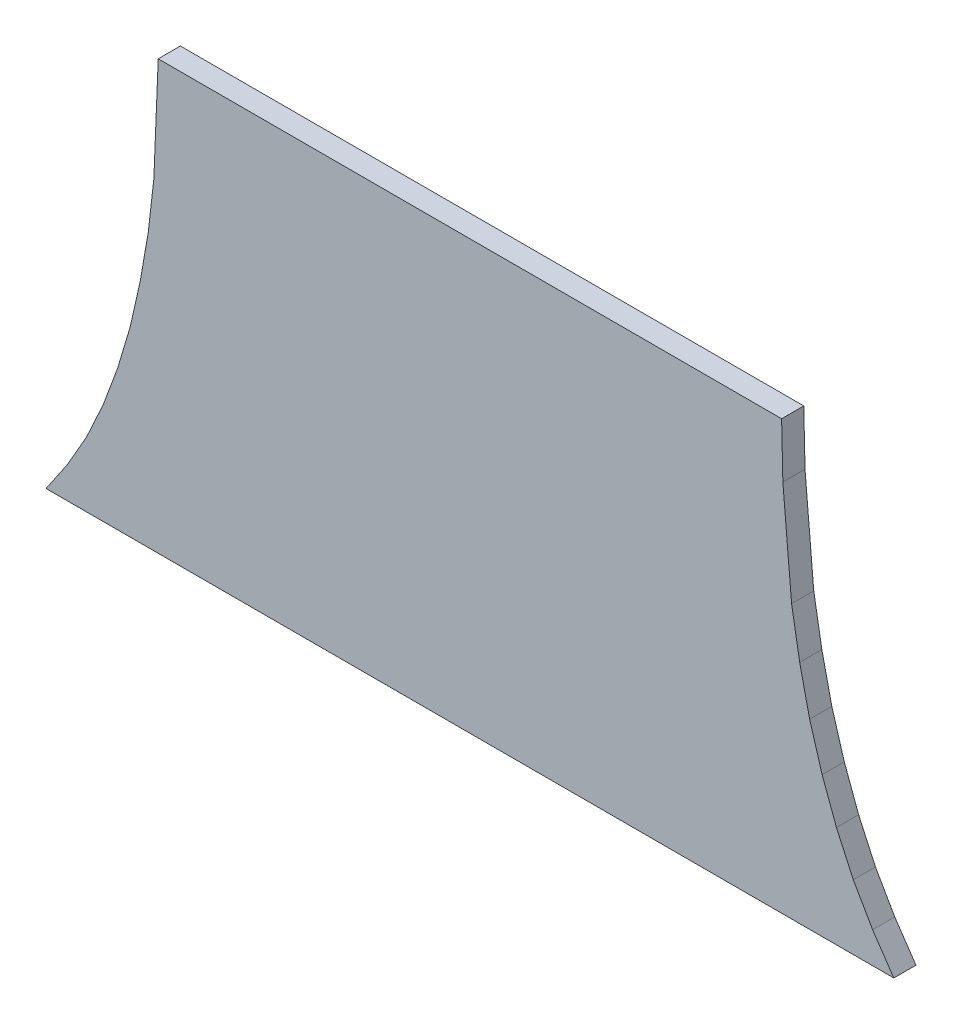
ISO-10303-21;
HEADER;
FILE_DESCRIPTION(('STEP AP214'),'2;1');
FILE_NAME('part.step','',(''),(''),'','','');
FILE_SCHEMA(('AUTOMOTIVE_DESIGN { 1 0 10303 214 1 1 1 1 }'));
ENDSEC;
DATA;
#1=APPLICATION_CONTEXT('core data for automotive mechanical design processes');
#2=APPLICATION_PROTOCOL_DEFINITION('international standard','automotive_design',2000,#1);
#3=PRODUCT_CONTEXT('',#1,'mechanical');
#4=PRODUCT('Part','Part','',(#3));
#5=PRODUCT_RELATED_PRODUCT_CATEGORY('part','',(#4));
#6=PRODUCT_DEFINITION_FORMATION('','',#4);
#7=PRODUCT_DEFINITION_CONTEXT('part definition',#1,'design');
#8=PRODUCT_DEFINITION('design','',#6,#7);
#9=PRODUCT_DEFINITION_SHAPE('','',#8);
#10=(LENGTH_UNIT() NAMED_UNIT(*) SI_UNIT(.MILLI.,.METRE.));
#11=(NAMED_UNIT(*) PLANE_ANGLE_UNIT() SI_UNIT($,.RADIAN.));
#12=(NAMED_UNIT(*) SI_UNIT($,.STERADIAN.) SOLID_ANGLE_UNIT());
#13=UNCERTAINTY_MEASURE_WITH_UNIT(LENGTH_MEASURE(1.E-05),#10,'distance_accuracy_value','');
#14=(GEOMETRIC_REPRESENTATION_CONTEXT(3) GLOBAL_UNCERTAINTY_ASSIGNED_CONTEXT((#13)) GLOBAL_UNIT_ASSIGNED_CONTEXT((#10,
#11,#12)) REPRESENTATION_CONTEXT('',''));
#15=CARTESIAN_POINT('',(0.,0.,0.));
#16=DIRECTION('',(0.,0.,1.));
#17=DIRECTION('',(1.,0.,0.));
#18=AXIS2_PLACEMENT_3D('',#15,#16,#17);
#19=CARTESIAN_POINT('',(77.5899963378906,105.467002868652,0.));
#20=DIRECTION('',(0.999154312002773,-0.0411176459231945,0.));
#21=DIRECTION('',(-0.0411176459231945,-0.999154312002773,0.));
#22=AXIS2_PLACEMENT_3D('',#19,#20,#21);
#23=PLANE('',#22);
#24=DIRECTION('',(-0.0411176459231945,-0.999154312002773,0.));
#25=VECTOR('',#24,1.);
#26=CARTESIAN_POINT('',(77.5899963378906,105.467002868652,0.03556));
#27=LINE('',#26,#25);
#28=CARTESIAN_POINT('',(77.5899963378906,105.467002868652,0.03556));
#29=VERTEX_POINT('',#28);
#30=CARTESIAN_POINT('',(77.5830001831055,105.296997070313,0.03556));
#31=VERTEX_POINT('',#30);
#32=EDGE_CURVE('E11',#29,#31,#27,.T.);
#33=ORIENTED_EDGE('',*,*,#32,.F.);
#34=DIRECTION('',(0.,0.,1.));
#35=VECTOR('',#34,1.);
#36=CARTESIAN_POINT('',(77.5899963378906,105.467002868652,0.));
#37=LINE('',#36,#35);
#38=CARTESIAN_POINT('',(77.5899963378906,105.467002868652,0.));
#39=VERTEX_POINT('',#38);
#40=EDGE_CURVE('E24',#39,#29,#37,.T.);
#41=ORIENTED_EDGE('',*,*,#40,.F.);
#42=DIRECTION('',(-0.0411176459231945,-0.999154312002773,0.));
#43=VECTOR('',#42,1.);
#44=CARTESIAN_POINT('',(77.5899963378906,105.467002868652,0.));
#45=LINE('',#44,#43);
#46=CARTESIAN_POINT('',(77.5830001831055,105.296997070313,0.));
#47=VERTEX_POINT('',#46);
#48=EDGE_CURVE('E172',#39,#47,#45,.T.);
#49=ORIENTED_EDGE('',*,*,#48,.T.);
#50=DIRECTION('',(0.,0.,1.));
#51=VECTOR('',#50,1.);
#52=CARTESIAN_POINT('',(77.5830001831055,105.296997070313,0.));
#53=LINE('',#52,#51);
#54=EDGE_CURVE('E37',#47,#31,#53,.T.);
#55=ORIENTED_EDGE('',*,*,#54,.T.);
#56=EDGE_LOOP('',(#33,#41,#49,#55));
#57=FACE_BOUND('',#56,.T.);
#58=ADVANCED_FACE('F17',(#57),#23,.F.);
#59=CARTESIAN_POINT('',(77.5830001831055,105.296997070313,0.));
#60=DIRECTION('',(0.993568501687247,-0.113232647478361,0.));
#61=DIRECTION('',(-0.113232647478361,-0.993568501687247,0.));
#62=AXIS2_PLACEMENT_3D('',#59,#60,#61);
#63=PLANE('',#62);
#64=DIRECTION('',(-0.113232647478361,-0.993568501687247,0.));
#65=VECTOR('',#64,1.);
#66=CARTESIAN_POINT('',(77.5830001831055,105.296997070313,0.03556));
#67=LINE('',#66,#65);
#68=CARTESIAN_POINT('',(77.5739974975586,105.218002319336,0.03556));
#69=VERTEX_POINT('',#68);
#70=EDGE_CURVE('E308',#31,#69,#67,.T.);
#71=ORIENTED_EDGE('',*,*,#70,.F.);
#72=ORIENTED_EDGE('',*,*,#54,.F.);
#73=DIRECTION('',(-0.113232647478361,-0.993568501687247,0.));
#74=VECTOR('',#73,1.);
#75=CARTESIAN_POINT('',(77.5830001831055,105.296997070313,0.));
#76=LINE('',#75,#74);
#77=CARTESIAN_POINT('',(77.5739974975586,105.218002319336,0.));
#78=VERTEX_POINT('',#77);
#79=EDGE_CURVE('E305',#47,#78,#76,.T.);
#80=ORIENTED_EDGE('',*,*,#79,.T.);
#81=DIRECTION('',(0.,0.,1.));
#82=VECTOR('',#81,1.);
#83=CARTESIAN_POINT('',(77.5739974975586,105.218002319336,0.));
#84=LINE('',#83,#82);
#85=EDGE_CURVE('E303',#78,#69,#84,.T.);
#86=ORIENTED_EDGE('',*,*,#85,.T.);
#87=EDGE_LOOP('',(#71,#72,#80,#86));
#88=FACE_BOUND('',#87,.T.);
#89=ADVANCED_FACE('F316',(#88),#63,.F.);
#90=CARTESIAN_POINT('',(77.5739974975586,105.218002319336,0.));
#91=DIRECTION('',(0.98530869501432,-0.170782831482494,0.));
#92=DIRECTION('',(-0.170782831482494,-0.98530869501432,0.));
#93=AXIS2_PLACEMENT_3D('',#90,#91,#92);
#94=PLANE('',#93);
#95=DIRECTION('',(-0.170782831482494,-0.98530869501432,0.));
#96=VECTOR('',#95,1.);
#97=CARTESIAN_POINT('',(77.5739974975586,105.218002319336,0.03556));
#98=LINE('',#97,#96);
#99=CARTESIAN_POINT('',(77.5609970092774,105.142997741699,0.03556));
#100=VERTEX_POINT('',#99);
#101=EDGE_CURVE('E300',#69,#100,#98,.T.);
#102=ORIENTED_EDGE('',*,*,#101,.F.);
#103=ORIENTED_EDGE('',*,*,#85,.F.);
#104=DIRECTION('',(-0.170782831482494,-0.98530869501432,0.));
#105=VECTOR('',#104,1.);
#106=CARTESIAN_POINT('',(77.5739974975586,105.218002319336,0.));
#107=LINE('',#106,#105);
#108=CARTESIAN_POINT('',(77.5609970092774,105.142997741699,0.));
#109=VERTEX_POINT('',#108);
#110=EDGE_CURVE('E297',#78,#109,#107,.T.);
#111=ORIENTED_EDGE('',*,*,#110,.T.);
#112=DIRECTION('',(0.,0.,1.));
#113=VECTOR('',#112,1.);
#114=CARTESIAN_POINT('',(77.5609970092774,105.142997741699,0.));
#115=LINE('',#114,#113);
#116=EDGE_CURVE('E295',#109,#100,#115,.T.);
#117=ORIENTED_EDGE('',*,*,#116,.T.);
#118=EDGE_LOOP('',(#102,#103,#111,#117));
#119=FACE_BOUND('',#118,.T.);
#120=ADVANCED_FACE('F322',(#119),#94,.F.);
#121=CARTESIAN_POINT('',(77.5609970092774,105.142997741699,0.));
#122=DIRECTION('',(0.975538987966482,-0.219826483748733,0.));
#123=DIRECTION('',(-0.219826483748733,-0.975538987966482,0.));
#124=AXIS2_PLACEMENT_3D('',#121,#122,#123);
#125=PLANE('',#124);
#126=DIRECTION('',(-0.219826483748733,-0.975538987966482,0.));
#127=VECTOR('',#126,1.);
#128=CARTESIAN_POINT('',(77.5609970092774,105.142997741699,0.03556));
#129=LINE('',#128,#127);
#130=CARTESIAN_POINT('',(77.5449981689453,105.071998596191,0.03556));
#131=VERTEX_POINT('',#130);
#132=EDGE_CURVE('E292',#100,#131,#129,.T.);
#133=ORIENTED_EDGE('',*,*,#132,.F.);
#134=ORIENTED_EDGE('',*,*,#116,.F.);
#135=DIRECTION('',(-0.219826483748733,-0.975538987966482,0.));
#136=VECTOR('',#135,1.);
#137=CARTESIAN_POINT('',(77.5609970092774,105.142997741699,0.));
#138=LINE('',#137,#136);
#139=CARTESIAN_POINT('',(77.5449981689453,105.071998596191,0.));
#140=VERTEX_POINT('',#139);
#141=EDGE_CURVE('E289',#109,#140,#138,.T.);
#142=ORIENTED_EDGE('',*,*,#141,.T.);
#143=DIRECTION('',(0.,0.,1.));
#144=VECTOR('',#143,1.);
#145=CARTESIAN_POINT('',(77.5449981689453,105.071998596191,0.));
#146=LINE('',#145,#144);
#147=EDGE_CURVE('E287',#140,#131,#146,.T.);
#148=ORIENTED_EDGE('',*,*,#147,.T.);
#149=EDGE_LOOP('',(#133,#134,#142,#148));
#150=FACE_BOUND('',#149,.T.);
#151=ADVANCED_FACE('F324',(#150),#125,.F.);
#152=CARTESIAN_POINT('',(77.5449981689453,105.071998596191,0.));
#153=DIRECTION('',(0.958233742102819,-0.285986180602538,0.));
#154=DIRECTION('',(-0.285986180602538,-0.958233742102819,0.));
#155=AXIS2_PLACEMENT_3D('',#152,#153,#154);
#156=PLANE('',#155);
#157=DIRECTION('',(-0.285986180602538,-0.958233742102819,0.));
#158=VECTOR('',#157,1.);
#159=CARTESIAN_POINT('',(77.5449981689453,105.071998596191,0.03556));
#160=LINE('',#159,#158);
#161=CARTESIAN_POINT('',(77.5250015258789,105.004997253418,0.03556));
#162=VERTEX_POINT('',#161);
#163=EDGE_CURVE('E284',#131,#162,#160,.T.);
#164=ORIENTED_EDGE('',*,*,#163,.F.);
#165=ORIENTED_EDGE('',*,*,#147,.F.);
#166=DIRECTION('',(-0.285986180602538,-0.958233742102819,0.));
#167=VECTOR('',#166,1.);
#168=CARTESIAN_POINT('',(77.5449981689453,105.071998596191,0.));
#169=LINE('',#168,#167);
#170=CARTESIAN_POINT('',(77.5250015258789,105.004997253418,0.));
#171=VERTEX_POINT('',#170);
#172=EDGE_CURVE('E281',#140,#171,#169,.T.);
#173=ORIENTED_EDGE('',*,*,#172,.T.);
#174=DIRECTION('',(0.,0.,1.));
#175=VECTOR('',#174,1.);
#176=CARTESIAN_POINT('',(77.5250015258789,105.004997253418,0.));
#177=LINE('',#176,#175);
#178=EDGE_CURVE('E279',#171,#162,#177,.T.);
#179=ORIENTED_EDGE('',*,*,#178,.T.);
#180=EDGE_LOOP('',(#164,#165,#173,#179));
#181=FACE_BOUND('',#180,.T.);
#182=ADVANCED_FACE('F329',(#181),#156,.F.);
#183=CARTESIAN_POINT('',(77.5250015258789,105.004997253418,0.));
#184=DIRECTION('',(0.93754679850257,-0.347859167792918,0.));
#185=DIRECTION('',(-0.347859167792918,-0.93754679850257,0.));
#186=AXIS2_PLACEMENT_3D('',#183,#184,#185);
#187=PLANE('',#186);
#188=DIRECTION('',(-0.347859167792918,-0.93754679850257,0.));
#189=VECTOR('',#188,1.);
#190=CARTESIAN_POINT('',(77.5250015258789,105.004997253418,0.03556));
#191=LINE('',#190,#189);
#192=CARTESIAN_POINT('',(77.5019989013672,104.943000793457,0.03556));
#193=VERTEX_POINT('',#192);
#194=EDGE_CURVE('E276',#162,#193,#191,.T.);
#195=ORIENTED_EDGE('',*,*,#194,.F.);
#196=ORIENTED_EDGE('',*,*,#178,.F.);
#197=DIRECTION('',(-0.347859167792918,-0.93754679850257,0.));
#198=VECTOR('',#197,1.);
#199=CARTESIAN_POINT('',(77.5250015258789,105.004997253418,0.));
#200=LINE('',#199,#198);
#201=CARTESIAN_POINT('',(77.5019989013672,104.943000793457,0.));
#202=VERTEX_POINT('',#201);
#203=EDGE_CURVE('E273',#171,#202,#200,.T.);
#204=ORIENTED_EDGE('',*,*,#203,.T.);
#205=DIRECTION('',(0.,0.,1.));
#206=VECTOR('',#205,1.);
#207=CARTESIAN_POINT('',(77.5019989013672,104.943000793457,0.));
#208=LINE('',#207,#206);
#209=EDGE_CURVE('E271',#202,#193,#208,.T.);
#210=ORIENTED_EDGE('',*,*,#209,.T.);
#211=EDGE_LOOP('',(#195,#196,#204,#210));
#212=FACE_BOUND('',#211,.T.);
#213=ADVANCED_FACE('F332',(#212),#187,.F.);
#214=CARTESIAN_POINT('',(77.5019989013672,104.943000793457,0.));
#215=DIRECTION('',(0.909300357598648,-0.416140432631788,0.));
#216=DIRECTION('',(-0.416140432631788,-0.909300357598648,0.));
#217=AXIS2_PLACEMENT_3D('',#214,#215,#216);
#218=PLANE('',#217);
#219=DIRECTION('',(-0.416140432631788,-0.909300357598648,0.));
#220=VECTOR('',#219,1.);
#221=CARTESIAN_POINT('',(77.5019989013672,104.943000793457,0.03556));
#222=LINE('',#221,#220);
#223=CARTESIAN_POINT('',(77.4749984741211,104.884002685547,0.03556));
#224=VERTEX_POINT('',#223);
#225=EDGE_CURVE('E268',#193,#224,#222,.T.);
#226=ORIENTED_EDGE('',*,*,#225,.F.);
#227=ORIENTED_EDGE('',*,*,#209,.F.);
#228=DIRECTION('',(-0.416140432631788,-0.909300357598648,0.));
#229=VECTOR('',#228,1.);
#230=CARTESIAN_POINT('',(77.5019989013672,104.943000793457,0.));
#231=LINE('',#230,#229);
#232=CARTESIAN_POINT('',(77.4749984741211,104.884002685547,0.));
#233=VERTEX_POINT('',#232);
#234=EDGE_CURVE('E265',#202,#233,#231,.T.);
#235=ORIENTED_EDGE('',*,*,#234,.T.);
#236=DIRECTION('',(0.,0.,1.));
#237=VECTOR('',#236,1.);
#238=CARTESIAN_POINT('',(77.4749984741211,104.884002685547,0.));
#239=LINE('',#238,#237);
#240=EDGE_CURVE('E263',#233,#224,#239,.T.);
#241=ORIENTED_EDGE('',*,*,#240,.T.);
#242=EDGE_LOOP('',(#226,#227,#235,#241));
#243=FACE_BOUND('',#242,.T.);
#244=ADVANCED_FACE('F337',(#243),#218,.F.);
#245=CARTESIAN_POINT('',(77.4749984741211,104.884002685547,0.));
#246=DIRECTION('',(0.867268772180106,-0.497840212117515,0.));
#247=DIRECTION('',(-0.497840212117515,-0.867268772180106,0.));
#248=AXIS2_PLACEMENT_3D('',#245,#246,#247);
#249=PLANE('',#248);
#250=DIRECTION('',(-0.497840212117515,-0.867268772180106,0.));
#251=VECTOR('',#250,1.);
#252=CARTESIAN_POINT('',(77.4749984741211,104.884002685547,0.03556));
#253=LINE('',#252,#251);
#254=CARTESIAN_POINT('',(77.4440002441406,104.830001831055,0.03556));
#255=VERTEX_POINT('',#254);
#256=EDGE_CURVE('E260',#224,#255,#253,.T.);
#257=ORIENTED_EDGE('',*,*,#256,.F.);
#258=ORIENTED_EDGE('',*,*,#240,.F.);
#259=DIRECTION('',(-0.497840212117515,-0.867268772180106,0.));
#260=VECTOR('',#259,1.);
#261=CARTESIAN_POINT('',(77.4749984741211,104.884002685547,0.));
#262=LINE('',#261,#260);
#263=CARTESIAN_POINT('',(77.4440002441406,104.830001831055,0.));
#264=VERTEX_POINT('',#263);
#265=EDGE_CURVE('E257',#233,#264,#262,.T.);
#266=ORIENTED_EDGE('',*,*,#265,.T.);
#267=DIRECTION('',(0.,0.,1.));
#268=VECTOR('',#267,1.);
#269=CARTESIAN_POINT('',(77.4440002441406,104.830001831055,0.));
#270=LINE('',#269,#268);
#271=EDGE_CURVE('E255',#264,#255,#270,.T.);
#272=ORIENTED_EDGE('',*,*,#271,.T.);
#273=EDGE_LOOP('',(#257,#258,#266,#272));
#274=FACE_BOUND('',#273,.T.);
#275=ADVANCED_FACE('F340',(#274),#249,.F.);
#276=CARTESIAN_POINT('',(77.4440002441406,104.830001831055,0.));
#277=DIRECTION('',(0.826968743041032,-0.562247897313219,0.));
#278=DIRECTION('',(-0.562247897313219,-0.826968743041032,0.));
#279=AXIS2_PLACEMENT_3D('',#276,#277,#278);
#280=PLANE('',#279);
#281=DIRECTION('',(-0.562247897313219,-0.826968743041032,0.));
#282=VECTOR('',#281,1.);
#283=CARTESIAN_POINT('',(77.4440002441406,104.830001831055,0.03556));
#284=LINE('',#283,#282);
#285=CARTESIAN_POINT('',(77.4100036621094,104.779998779297,0.03556));
#286=VERTEX_POINT('',#285);
#287=EDGE_CURVE('E252',#255,#286,#284,.T.);
#288=ORIENTED_EDGE('',*,*,#287,.F.);
#289=ORIENTED_EDGE('',*,*,#271,.F.);
#290=DIRECTION('',(-0.562247897313219,-0.826968743041032,0.));
#291=VECTOR('',#290,1.);
#292=CARTESIAN_POINT('',(77.4440002441406,104.830001831055,0.));
#293=LINE('',#292,#291);
#294=CARTESIAN_POINT('',(77.4100036621094,104.779998779297,0.));
#295=VERTEX_POINT('',#294);
#296=EDGE_CURVE('E249',#264,#295,#293,.T.);
#297=ORIENTED_EDGE('',*,*,#296,.T.);
#298=DIRECTION('',(0.,0.,1.));
#299=VECTOR('',#298,1.);
#300=CARTESIAN_POINT('',(77.4100036621094,104.779998779297,0.));
#301=LINE('',#300,#299);
#302=EDGE_CURVE('E247',#295,#286,#301,.T.);
#303=ORIENTED_EDGE('',*,*,#302,.T.);
#304=EDGE_LOOP('',(#288,#289,#297,#303));
#305=FACE_BOUND('',#304,.T.);
#306=ADVANCED_FACE('F345',(#305),#280,.F.);
#307=CARTESIAN_POINT('',(77.4100036621094,104.779998779297,0.));
#308=DIRECTION('',(0.,1.,0.));
#309=DIRECTION('',(1.,0.,0.));
#310=AXIS2_PLACEMENT_3D('',#307,#308,#309);
#311=PLANE('',#310);
#312=DIRECTION('',(1.,0.,0.));
#313=VECTOR('',#312,1.);
#314=CARTESIAN_POINT('',(77.4100036621094,104.779998779297,0.03556));
#315=LINE('',#314,#313);
#316=CARTESIAN_POINT('',(78.7699966430664,104.779998779297,0.03556));
#317=VERTEX_POINT('',#316);
#318=EDGE_CURVE('E244',#286,#317,#315,.T.);
#319=ORIENTED_EDGE('',*,*,#318,.F.);
#320=ORIENTED_EDGE('',*,*,#302,.F.);
#321=DIRECTION('',(1.,0.,0.));
#322=VECTOR('',#321,1.);
#323=CARTESIAN_POINT('',(77.4100036621094,104.779998779297,0.));
#324=LINE('',#323,#322);
#325=CARTESIAN_POINT('',(78.7699966430664,104.779998779297,0.));
#326=VERTEX_POINT('',#325);
#327=EDGE_CURVE('E241',#295,#326,#324,.T.);
#328=ORIENTED_EDGE('',*,*,#327,.T.);
#329=DIRECTION('',(0.,0.,1.));
#330=VECTOR('',#329,1.);
#331=CARTESIAN_POINT('',(78.7699966430664,104.779998779297,0.));
#332=LINE('',#331,#330);
#333=EDGE_CURVE('E239',#326,#317,#332,.T.);
#334=ORIENTED_EDGE('',*,*,#333,.T.);
#335=EDGE_LOOP('',(#319,#320,#328,#334));
#336=FACE_BOUND('',#335,.T.);
#337=ADVANCED_FACE('F348',(#336),#311,.F.);
#338=CARTESIAN_POINT('',(78.7699966430664,104.779998779297,0.));
#339=DIRECTION('',(-0.826968743041032,-0.562247897313219,0.));
#340=DIRECTION('',(-0.562247897313219,0.826968743041032,0.));
#341=AXIS2_PLACEMENT_3D('',#338,#339,#340);
#342=PLANE('',#341);
#343=DIRECTION('',(-0.562247897313219,0.826968743041032,0.));
#344=VECTOR('',#343,1.);
#345=CARTESIAN_POINT('',(78.7699966430664,104.779998779297,0.03556));
#346=LINE('',#345,#344);
#347=CARTESIAN_POINT('',(78.7360000610352,104.830001831055,0.03556));
#348=VERTEX_POINT('',#347);
#349=EDGE_CURVE('E236',#317,#348,#346,.T.);
#350=ORIENTED_EDGE('',*,*,#349,.F.);
#351=ORIENTED_EDGE('',*,*,#333,.F.);
#352=DIRECTION('',(-0.562247897313219,0.826968743041032,0.));
#353=VECTOR('',#352,1.);
#354=CARTESIAN_POINT('',(78.7699966430664,104.779998779297,0.));
#355=LINE('',#354,#353);
#356=CARTESIAN_POINT('',(78.7360000610352,104.830001831055,0.));
#357=VERTEX_POINT('',#356);
#358=EDGE_CURVE('E233',#326,#357,#355,.T.);
#359=ORIENTED_EDGE('',*,*,#358,.T.);
#360=DIRECTION('',(0.,0.,1.));
#361=VECTOR('',#360,1.);
#362=CARTESIAN_POINT('',(78.7360000610352,104.830001831055,0.));
#363=LINE('',#362,#361);
#364=EDGE_CURVE('E231',#357,#348,#363,.T.);
#365=ORIENTED_EDGE('',*,*,#364,.T.);
#366=EDGE_LOOP('',(#350,#351,#359,#365));
#367=FACE_BOUND('',#366,.T.);
#368=ADVANCED_FACE('F353',(#367),#342,.F.);
#369=CARTESIAN_POINT('',(78.7360000610352,104.830001831055,0.));
#370=DIRECTION('',(-0.867268772180106,-0.497840212117515,0.));
#371=DIRECTION('',(-0.497840212117515,0.867268772180106,0.));
#372=AXIS2_PLACEMENT_3D('',#369,#370,#371);
#373=PLANE('',#372);
#374=DIRECTION('',(-0.497840212117515,0.867268772180106,0.));
#375=VECTOR('',#374,1.);
#376=CARTESIAN_POINT('',(78.7360000610352,104.830001831055,0.03556));
#377=LINE('',#376,#375);
#378=CARTESIAN_POINT('',(78.7050018310547,104.884002685547,0.03556));
#379=VERTEX_POINT('',#378);
#380=EDGE_CURVE('E228',#348,#379,#377,.T.);
#381=ORIENTED_EDGE('',*,*,#380,.F.);
#382=ORIENTED_EDGE('',*,*,#364,.F.);
#383=DIRECTION('',(-0.497840212117515,0.867268772180106,0.));
#384=VECTOR('',#383,1.);
#385=CARTESIAN_POINT('',(78.7360000610352,104.830001831055,0.));
#386=LINE('',#385,#384);
#387=CARTESIAN_POINT('',(78.7050018310547,104.884002685547,0.));
#388=VERTEX_POINT('',#387);
#389=EDGE_CURVE('E225',#357,#388,#386,.T.);
#390=ORIENTED_EDGE('',*,*,#389,.T.);
#391=DIRECTION('',(0.,0.,1.));
#392=VECTOR('',#391,1.);
#393=CARTESIAN_POINT('',(78.7050018310547,104.884002685547,0.));
#394=LINE('',#393,#392);
#395=EDGE_CURVE('E223',#388,#379,#394,.T.);
#396=ORIENTED_EDGE('',*,*,#395,.T.);
#397=EDGE_LOOP('',(#381,#382,#390,#396));
#398=FACE_BOUND('',#397,.T.);
#399=ADVANCED_FACE('F356',(#398),#373,.F.);
#400=CARTESIAN_POINT('',(78.7050018310547,104.884002685547,0.));
#401=DIRECTION('',(-0.909300357598648,-0.416140432631788,0.));
#402=DIRECTION('',(-0.416140432631788,0.909300357598648,0.));
#403=AXIS2_PLACEMENT_3D('',#400,#401,#402);
#404=PLANE('',#403);
#405=DIRECTION('',(-0.416140432631788,0.909300357598648,0.));
#406=VECTOR('',#405,1.);
#407=CARTESIAN_POINT('',(78.7050018310547,104.884002685547,0.03556));
#408=LINE('',#407,#406);
#409=CARTESIAN_POINT('',(78.6780014038086,104.943000793457,0.03556));
#410=VERTEX_POINT('',#409);
#411=EDGE_CURVE('E220',#379,#410,#408,.T.);
#412=ORIENTED_EDGE('',*,*,#411,.F.);
#413=ORIENTED_EDGE('',*,*,#395,.F.);
#414=DIRECTION('',(-0.416140432631788,0.909300357598648,0.));
#415=VECTOR('',#414,1.);
#416=CARTESIAN_POINT('',(78.7050018310547,104.884002685547,0.));
#417=LINE('',#416,#415);
#418=CARTESIAN_POINT('',(78.6780014038086,104.943000793457,0.));
#419=VERTEX_POINT('',#418);
#420=EDGE_CURVE('E217',#388,#419,#417,.T.);
#421=ORIENTED_EDGE('',*,*,#420,.T.);
#422=DIRECTION('',(0.,0.,1.));
#423=VECTOR('',#422,1.);
#424=CARTESIAN_POINT('',(78.6780014038086,104.943000793457,0.));
#425=LINE('',#424,#423);
#426=EDGE_CURVE('E215',#419,#410,#425,.T.);
#427=ORIENTED_EDGE('',*,*,#426,.T.);
#428=EDGE_LOOP('',(#412,#413,#421,#427));
#429=FACE_BOUND('',#428,.T.);
#430=ADVANCED_FACE('F361',(#429),#404,.F.);
#431=CARTESIAN_POINT('',(78.6780014038086,104.943000793457,0.));
#432=DIRECTION('',(-0.93754679850257,-0.347859167792918,0.));
#433=DIRECTION('',(-0.347859167792918,0.93754679850257,0.));
#434=AXIS2_PLACEMENT_3D('',#431,#432,#433);
#435=PLANE('',#434);
#436=DIRECTION('',(-0.347859167792918,0.93754679850257,0.));
#437=VECTOR('',#436,1.);
#438=CARTESIAN_POINT('',(78.6780014038086,104.943000793457,0.03556));
#439=LINE('',#438,#437);
#440=CARTESIAN_POINT('',(78.6549987792969,105.004997253418,0.03556));
#441=VERTEX_POINT('',#440);
#442=EDGE_CURVE('E212',#410,#441,#439,.T.);
#443=ORIENTED_EDGE('',*,*,#442,.F.);
#444=ORIENTED_EDGE('',*,*,#426,.F.);
#445=DIRECTION('',(-0.347859167792918,0.93754679850257,0.));
#446=VECTOR('',#445,1.);
#447=CARTESIAN_POINT('',(78.6780014038086,104.943000793457,0.));
#448=LINE('',#447,#446);
#449=CARTESIAN_POINT('',(78.6549987792969,105.004997253418,0.));
#450=VERTEX_POINT('',#449);
#451=EDGE_CURVE('E209',#419,#450,#448,.T.);
#452=ORIENTED_EDGE('',*,*,#451,.T.);
#453=DIRECTION('',(0.,0.,1.));
#454=VECTOR('',#453,1.);
#455=CARTESIAN_POINT('',(78.6549987792969,105.004997253418,0.));
#456=LINE('',#455,#454);
#457=EDGE_CURVE('E207',#450,#441,#456,.T.);
#458=ORIENTED_EDGE('',*,*,#457,.T.);
#459=EDGE_LOOP('',(#443,#444,#452,#458));
#460=FACE_BOUND('',#459,.T.);
#461=ADVANCED_FACE('F364',(#460),#435,.F.);
#462=CARTESIAN_POINT('',(78.6549987792969,105.004997253418,0.));
#463=DIRECTION('',(-0.958233742102819,-0.285986180602538,0.));
#464=DIRECTION('',(-0.285986180602538,0.958233742102819,0.));
#465=AXIS2_PLACEMENT_3D('',#462,#463,#464);
#466=PLANE('',#465);
#467=DIRECTION('',(-0.285986180602538,0.958233742102819,0.));
#468=VECTOR('',#467,1.);
#469=CARTESIAN_POINT('',(78.6549987792969,105.004997253418,0.03556));
#470=LINE('',#469,#468);
#471=CARTESIAN_POINT('',(78.6350021362305,105.071998596191,0.03556));
#472=VERTEX_POINT('',#471);
#473=EDGE_CURVE('E204',#441,#472,#470,.T.);
#474=ORIENTED_EDGE('',*,*,#473,.F.);
#475=ORIENTED_EDGE('',*,*,#457,.F.);
#476=DIRECTION('',(-0.285986180602538,0.958233742102819,0.));
#477=VECTOR('',#476,1.);
#478=CARTESIAN_POINT('',(78.6549987792969,105.004997253418,0.));
#479=LINE('',#478,#477);
#480=CARTESIAN_POINT('',(78.6350021362305,105.071998596191,0.));
#481=VERTEX_POINT('',#480);
#482=EDGE_CURVE('E201',#450,#481,#479,.T.);
#483=ORIENTED_EDGE('',*,*,#482,.T.);
#484=DIRECTION('',(0.,0.,1.));
#485=VECTOR('',#484,1.);
#486=CARTESIAN_POINT('',(78.6350021362305,105.071998596191,0.));
#487=LINE('',#486,#485);
#488=EDGE_CURVE('E199',#481,#472,#487,.T.);
#489=ORIENTED_EDGE('',*,*,#488,.T.);
#490=EDGE_LOOP('',(#474,#475,#483,#489));
#491=FACE_BOUND('',#490,.T.);
#492=ADVANCED_FACE('F369',(#491),#466,.F.);
#493=CARTESIAN_POINT('',(78.6350021362305,105.071998596191,0.));
#494=DIRECTION('',(-0.975538987966482,-0.219826483748733,0.));
#495=DIRECTION('',(-0.219826483748733,0.975538987966482,0.));
#496=AXIS2_PLACEMENT_3D('',#493,#494,#495);
#497=PLANE('',#496);
#498=DIRECTION('',(-0.219826483748733,0.975538987966482,0.));
#499=VECTOR('',#498,1.);
#500=CARTESIAN_POINT('',(78.6350021362305,105.071998596191,0.03556));
#501=LINE('',#500,#499);
#502=CARTESIAN_POINT('',(78.6190032958984,105.142997741699,0.03556));
#503=VERTEX_POINT('',#502);
#504=EDGE_CURVE('E196',#472,#503,#501,.T.);
#505=ORIENTED_EDGE('',*,*,#504,.F.);
#506=ORIENTED_EDGE('',*,*,#488,.F.);
#507=DIRECTION('',(-0.219826483748733,0.975538987966482,0.));
#508=VECTOR('',#507,1.);
#509=CARTESIAN_POINT('',(78.6350021362305,105.071998596191,0.));
#510=LINE('',#509,#508);
#511=CARTESIAN_POINT('',(78.6190032958984,105.142997741699,0.));
#512=VERTEX_POINT('',#511);
#513=EDGE_CURVE('E193',#481,#512,#510,.T.);
#514=ORIENTED_EDGE('',*,*,#513,.T.);
#515=DIRECTION('',(0.,0.,1.));
#516=VECTOR('',#515,1.);
#517=CARTESIAN_POINT('',(78.6190032958984,105.142997741699,0.));
#518=LINE('',#517,#516);
#519=EDGE_CURVE('E191',#512,#503,#518,.T.);
#520=ORIENTED_EDGE('',*,*,#519,.T.);
#521=EDGE_LOOP('',(#505,#506,#514,#520));
#522=FACE_BOUND('',#521,.T.);
#523=ADVANCED_FACE('F372',(#522),#497,.F.);
#524=CARTESIAN_POINT('',(78.6190032958984,105.142997741699,0.));
#525=DIRECTION('',(-0.98530869501432,-0.170782831482494,0.));
#526=DIRECTION('',(-0.170782831482494,0.98530869501432,0.));
#527=AXIS2_PLACEMENT_3D('',#524,#525,#526);
#528=PLANE('',#527);
#529=DIRECTION('',(-0.170782831482494,0.98530869501432,0.));
#530=VECTOR('',#529,1.);
#531=CARTESIAN_POINT('',(78.6190032958984,105.142997741699,0.03556));
#532=LINE('',#531,#530);
#533=CARTESIAN_POINT('',(78.6060028076172,105.218002319336,0.03556));
#534=VERTEX_POINT('',#533);
#535=EDGE_CURVE('E188',#503,#534,#532,.T.);
#536=ORIENTED_EDGE('',*,*,#535,.F.);
#537=ORIENTED_EDGE('',*,*,#519,.F.);
#538=DIRECTION('',(-0.170782831482494,0.98530869501432,0.));
#539=VECTOR('',#538,1.);
#540=CARTESIAN_POINT('',(78.6190032958984,105.142997741699,0.));
#541=LINE('',#540,#539);
#542=CARTESIAN_POINT('',(78.6060028076172,105.218002319336,0.));
#543=VERTEX_POINT('',#542);
#544=EDGE_CURVE('E185',#512,#543,#541,.T.);
#545=ORIENTED_EDGE('',*,*,#544,.T.);
#546=DIRECTION('',(0.,0.,1.));
#547=VECTOR('',#546,1.);
#548=CARTESIAN_POINT('',(78.6060028076172,105.218002319336,0.));
#549=LINE('',#548,#547);
#550=EDGE_CURVE('E183',#543,#534,#549,.T.);
#551=ORIENTED_EDGE('',*,*,#550,.T.);
#552=EDGE_LOOP('',(#536,#537,#545,#551));
#553=FACE_BOUND('',#552,.T.);
#554=ADVANCED_FACE('F377',(#553),#528,.F.);
#555=CARTESIAN_POINT('',(78.6060028076172,105.218002319336,0.));
#556=DIRECTION('',(-0.996286401272494,-0.0861011419175353,0.));
#557=DIRECTION('',(-0.0861011419175353,0.996286401272494,0.));
#558=AXIS2_PLACEMENT_3D('',#555,#556,#557);
#559=PLANE('',#558);
#560=DIRECTION('',(-0.0861011419175352,0.996286401272494,0.));
#561=VECTOR('',#560,1.);
#562=CARTESIAN_POINT('',(78.6060028076172,105.218002319336,0.03556));
#563=LINE('',#562,#561);
#564=CARTESIAN_POINT('',(78.5920028686523,105.379997253418,0.03556));
#565=VERTEX_POINT('',#564);
#566=EDGE_CURVE('E180',#534,#565,#563,.T.);
#567=ORIENTED_EDGE('',*,*,#566,.F.);
#568=ORIENTED_EDGE('',*,*,#550,.F.);
#569=DIRECTION('',(-0.0861011419175352,0.996286401272494,0.));
#570=VECTOR('',#569,1.);
#571=CARTESIAN_POINT('',(78.6060028076172,105.218002319336,0.));
#572=LINE('',#571,#570);
#573=CARTESIAN_POINT('',(78.5920028686523,105.379997253418,0.));
#574=VERTEX_POINT('',#573);
#575=EDGE_CURVE('E178',#543,#574,#572,.T.);
#576=ORIENTED_EDGE('',*,*,#575,.T.);
#577=DIRECTION('',(0.,0.,1.));
#578=VECTOR('',#577,1.);
#579=CARTESIAN_POINT('',(78.5920028686523,105.379997253418,0.));
#580=LINE('',#579,#578);
#581=EDGE_CURVE('E163',#574,#565,#580,.T.);
#582=ORIENTED_EDGE('',*,*,#581,.T.);
#583=EDGE_LOOP('',(#567,#568,#576,#582));
#584=FACE_BOUND('',#583,.T.);
#585=ADVANCED_FACE('F379',(#584),#559,.F.);
#586=CARTESIAN_POINT('',(78.5920028686523,105.379997253418,0.));
#587=DIRECTION('',(-0.999734176183825,-0.0230559530284414,0.));
#588=DIRECTION('',(-0.0230559530284414,0.999734176183825,0.));
#589=AXIS2_PLACEMENT_3D('',#586,#587,#588);
#590=PLANE('',#589);
#591=DIRECTION('',(-0.0230559530284414,0.999734176183824,0.));
#592=VECTOR('',#591,1.);
#593=CARTESIAN_POINT('',(78.5920028686523,105.379997253418,0.03556));
#594=LINE('',#593,#592);
#595=CARTESIAN_POINT('',(78.5899963378906,105.467002868652,0.03556));
#596=VERTEX_POINT('',#595);
#597=EDGE_CURVE('E167',#565,#596,#594,.T.);
#598=ORIENTED_EDGE('',*,*,#597,.F.);
#599=ORIENTED_EDGE('',*,*,#581,.F.);
#600=DIRECTION('',(-0.0230559530284414,0.999734176183824,0.));
#601=VECTOR('',#600,1.);
#602=CARTESIAN_POINT('',(78.5920028686523,105.379997253418,0.));
#603=LINE('',#602,#601);
#604=CARTESIAN_POINT('',(78.5899963378906,105.467002868652,0.));
#605=VERTEX_POINT('',#604);
#606=EDGE_CURVE('E159',#574,#605,#603,.T.);
#607=ORIENTED_EDGE('',*,*,#606,.T.);
#608=DIRECTION('',(0.,0.,1.));
#609=VECTOR('',#608,1.);
#610=CARTESIAN_POINT('',(78.5899963378906,105.467002868652,0.));
#611=LINE('',#610,#609);
#612=EDGE_CURVE('E149',#605,#596,#611,.T.);
#613=ORIENTED_EDGE('',*,*,#612,.T.);
#614=EDGE_LOOP('',(#598,#599,#607,#613));
#615=FACE_BOUND('',#614,.T.);
#616=ADVANCED_FACE('F162',(#615),#590,.F.);
#617=CARTESIAN_POINT('',(78.5899963378906,105.467002868652,0.));
#618=DIRECTION('',(0.,-1.,0.));
#619=DIRECTION('',(-1.,0.,0.));
#620=AXIS2_PLACEMENT_3D('',#617,#618,#619);
#621=PLANE('',#620);
#622=DIRECTION('',(-1.,0.,0.));
#623=VECTOR('',#622,1.);
#624=CARTESIAN_POINT('',(78.5899963378906,105.467002868652,0.03556));
#625=LINE('',#624,#623);
#626=EDGE_CURVE('E155',#596,#29,#625,.T.);
#627=ORIENTED_EDGE('',*,*,#626,.F.);
#628=ORIENTED_EDGE('',*,*,#612,.F.);
#629=DIRECTION('',(-1.,0.,0.));
#630=VECTOR('',#629,1.);
#631=CARTESIAN_POINT('',(78.5899963378906,105.467002868652,0.));
#632=LINE('',#631,#630);
#633=EDGE_CURVE('E153',#605,#39,#632,.T.);
#634=ORIENTED_EDGE('',*,*,#633,.T.);
#635=ORIENTED_EDGE('',*,*,#40,.T.);
#636=EDGE_LOOP('',(#627,#628,#634,#635));
#637=FACE_BOUND('',#636,.T.);
#638=ADVANCED_FACE('F151',(#637),#621,.F.);
#639=CARTESIAN_POINT('',(77.5899963378906,105.467002868652,0.));
#640=DIRECTION('',(0.,0.,1.));
#641=DIRECTION('',(1.,0.,0.));
#642=AXIS2_PLACEMENT_3D('',#639,#640,#641);
#643=PLANE('',#642);
#644=ORIENTED_EDGE('',*,*,#633,.F.);
#645=ORIENTED_EDGE('',*,*,#606,.F.);
#646=ORIENTED_EDGE('',*,*,#575,.F.);
#647=ORIENTED_EDGE('',*,*,#544,.F.);
#648=ORIENTED_EDGE('',*,*,#513,.F.);
#649=ORIENTED_EDGE('',*,*,#482,.F.);
#650=ORIENTED_EDGE('',*,*,#451,.F.);
#651=ORIENTED_EDGE('',*,*,#420,.F.);
#652=ORIENTED_EDGE('',*,*,#389,.F.);
#653=ORIENTED_EDGE('',*,*,#358,.F.);
#654=ORIENTED_EDGE('',*,*,#327,.F.);
#655=ORIENTED_EDGE('',*,*,#296,.F.);
#656=ORIENTED_EDGE('',*,*,#265,.F.);
#657=ORIENTED_EDGE('',*,*,#234,.F.);
#658=ORIENTED_EDGE('',*,*,#203,.F.);
#659=ORIENTED_EDGE('',*,*,#172,.F.);
#660=ORIENTED_EDGE('',*,*,#141,.F.);
#661=ORIENTED_EDGE('',*,*,#110,.F.);
#662=ORIENTED_EDGE('',*,*,#79,.F.);
#663=ORIENTED_EDGE('',*,*,#48,.F.);
#664=EDGE_LOOP('',(#644,#645,#646,#647,#648,#649,#650,#651,#652,#653,#654,#655,#656,#657,#658,
#659,#660,#661,#662,#663));
#665=FACE_BOUND('',#664,.T.);
#666=ADVANCED_FACE('F170',(#665),#643,.F.);
#667=CARTESIAN_POINT('',(77.5899963378906,105.467002868652,0.03556));
#668=DIRECTION('',(0.,0.,1.));
#669=DIRECTION('',(1.,0.,0.));
#670=AXIS2_PLACEMENT_3D('',#667,#668,#669);
#671=PLANE('',#670);
#672=ORIENTED_EDGE('',*,*,#32,.T.);
#673=ORIENTED_EDGE('',*,*,#70,.T.);
#674=ORIENTED_EDGE('',*,*,#101,.T.);
#675=ORIENTED_EDGE('',*,*,#132,.T.);
#676=ORIENTED_EDGE('',*,*,#163,.T.);
#677=ORIENTED_EDGE('',*,*,#194,.T.);
#678=ORIENTED_EDGE('',*,*,#225,.T.);
#679=ORIENTED_EDGE('',*,*,#256,.T.);
#680=ORIENTED_EDGE('',*,*,#287,.T.);
#681=ORIENTED_EDGE('',*,*,#318,.T.);
#682=ORIENTED_EDGE('',*,*,#349,.T.);
#683=ORIENTED_EDGE('',*,*,#380,.T.);
#684=ORIENTED_EDGE('',*,*,#411,.T.);
#685=ORIENTED_EDGE('',*,*,#442,.T.);
#686=ORIENTED_EDGE('',*,*,#473,.T.);
#687=ORIENTED_EDGE('',*,*,#504,.T.);
#688=ORIENTED_EDGE('',*,*,#535,.T.);
#689=ORIENTED_EDGE('',*,*,#566,.T.);
#690=ORIENTED_EDGE('',*,*,#597,.T.);
#691=ORIENTED_EDGE('',*,*,#626,.T.);
#692=EDGE_LOOP('',(#672,#673,#674,#675,#676,#677,#678,#679,#680,#681,#682,#683,#684,#685,#686,
#687,#688,#689,#690,#691));
#693=FACE_BOUND('',#692,.T.);
#694=ADVANCED_FACE('F319',(#693),#671,.T.);
#695=CLOSED_SHELL('',(#58,#89,#120,#151,#182,#213,#244,#275,#306,#337,#368,#399,#430,#461,#492,
#523,#554,#585,#616,#638,#666,#694));
#696=MANIFOLD_SOLID_BREP('B1',#695);
#697=ADVANCED_BREP_SHAPE_REPRESENTATION('',(#18,#696),#14);
#698=SHAPE_DEFINITION_REPRESENTATION(#9,#697);
ENDSEC;
END-ISO-10303-21;
